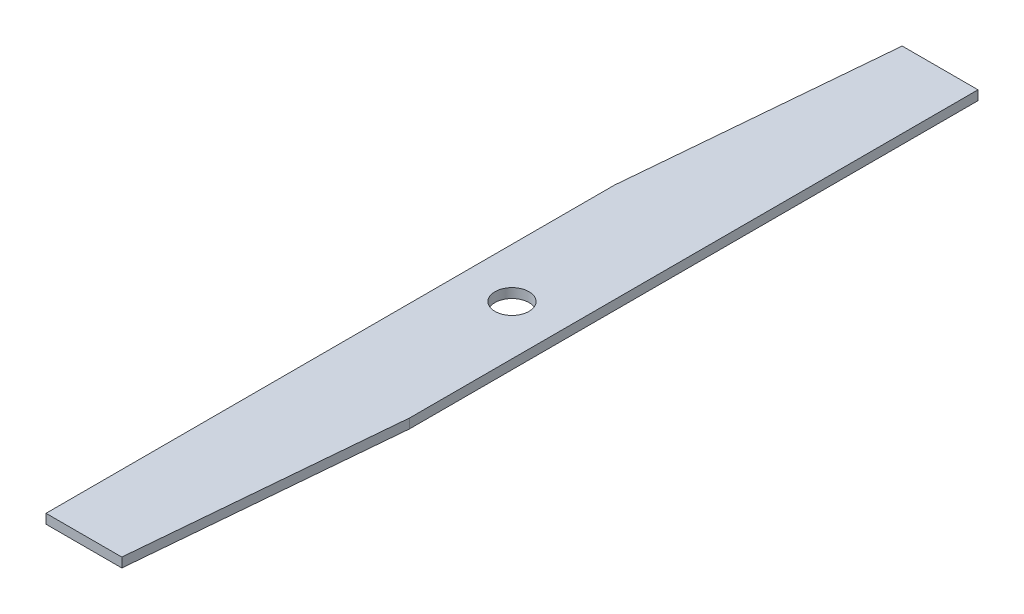
ISO-10303-21;
HEADER;
FILE_DESCRIPTION(('STEP AP214'),'2;1');
FILE_NAME('part.step','',(''),(''),'','','');
FILE_SCHEMA(('AUTOMOTIVE_DESIGN { 1 0 10303 214 1 1 1 1 }'));
ENDSEC;
DATA;
#1=APPLICATION_CONTEXT('core data for automotive mechanical design processes');
#2=APPLICATION_PROTOCOL_DEFINITION('international standard','automotive_design',2000,#1);
#3=PRODUCT_CONTEXT('',#1,'mechanical');
#4=PRODUCT('Part','Part','',(#3));
#5=PRODUCT_RELATED_PRODUCT_CATEGORY('part','',(#4));
#6=PRODUCT_DEFINITION_FORMATION('','',#4);
#7=PRODUCT_DEFINITION_CONTEXT('part definition',#1,'design');
#8=PRODUCT_DEFINITION('design','',#6,#7);
#9=PRODUCT_DEFINITION_SHAPE('','',#8);
#10=(LENGTH_UNIT() NAMED_UNIT(*) SI_UNIT(.MILLI.,.METRE.));
#11=(NAMED_UNIT(*) PLANE_ANGLE_UNIT() SI_UNIT($,.RADIAN.));
#12=(NAMED_UNIT(*) SI_UNIT($,.STERADIAN.) SOLID_ANGLE_UNIT());
#13=UNCERTAINTY_MEASURE_WITH_UNIT(LENGTH_MEASURE(1.E-05),#10,'distance_accuracy_value','');
#14=(GEOMETRIC_REPRESENTATION_CONTEXT(3) GLOBAL_UNCERTAINTY_ASSIGNED_CONTEXT((#13)) GLOBAL_UNIT_ASSIGNED_CONTEXT((#10,
#11,#12)) REPRESENTATION_CONTEXT('',''));
#15=CARTESIAN_POINT('',(0.,0.,0.));
#16=DIRECTION('',(0.,0.,1.));
#17=DIRECTION('',(1.,0.,0.));
#18=AXIS2_PLACEMENT_3D('',#15,#16,#17);
#19=CARTESIAN_POINT('',(-16.7518020827997,3.175,-1.48465657835669));
#20=DIRECTION('',(-0.996095641566478,0.,-0.0882806482320224));
#21=DIRECTION('',(-0.0882806482320225,0.,0.996095641566478));
#22=AXIS2_PLACEMENT_3D('',#19,#20,#21);
#23=PLANE('',#22);
#24=DIRECTION('',(0.0882806482320225,0.,-0.996095641566478));
#25=VECTOR('',#24,1.);
#26=CARTESIAN_POINT('',(-16.7518020827997,0.,-1.48465657835669));
#27=LINE('',#26,#25);
#28=CARTESIAN_POINT('',(0.,0.,-190.5));
#29=VERTEX_POINT('',#28);
#30=CARTESIAN_POINT('',(7.84814962782679,0.,-279.05290253526));
#31=VERTEX_POINT('',#30);
#32=EDGE_CURVE('E117',#29,#31,#27,.T.);
#33=ORIENTED_EDGE('',*,*,#32,.F.);
#34=DIRECTION('',(0.,-1.,0.));
#35=VECTOR('',#34,1.);
#36=CARTESIAN_POINT('',(0.,3.175,-190.5));
#37=LINE('',#36,#35);
#38=CARTESIAN_POINT('',(0.,3.175,-190.5));
#39=VERTEX_POINT('',#38);
#40=EDGE_CURVE('E11',#39,#29,#37,.T.);
#41=ORIENTED_EDGE('',*,*,#40,.F.);
#42=DIRECTION('',(0.0882806482320225,0.,-0.996095641566478));
#43=VECTOR('',#42,1.);
#44=CARTESIAN_POINT('',(-16.7518020827997,3.175,-1.48465657835669));
#45=LINE('',#44,#43);
#46=CARTESIAN_POINT('',(7.84814962782679,3.175,-279.05290253526));
#47=VERTEX_POINT('',#46);
#48=EDGE_CURVE('E228',#39,#47,#45,.T.);
#49=ORIENTED_EDGE('',*,*,#48,.T.);
#50=DIRECTION('',(0.,-1.,0.));
#51=VECTOR('',#50,1.);
#52=CARTESIAN_POINT('',(7.84814962782679,3.175,-279.05290253526));
#53=LINE('',#52,#51);
#54=EDGE_CURVE('E49',#47,#31,#53,.T.);
#55=ORIENTED_EDGE('',*,*,#54,.T.);
#56=EDGE_LOOP('',(#33,#41,#49,#55));
#57=FACE_BOUND('',#56,.T.);
#58=ADVANCED_FACE('F32',(#57),#23,.T.);
#59=CARTESIAN_POINT('',(0.,3.175,0.));
#60=DIRECTION('',(-1.,0.,0.));
#61=DIRECTION('',(0.,0.,1.));
#62=AXIS2_PLACEMENT_3D('',#59,#60,#61);
#63=PLANE('',#62);
#64=DIRECTION('',(0.,0.,-1.));
#65=VECTOR('',#64,1.);
#66=CARTESIAN_POINT('',(0.,0.,0.));
#67=LINE('',#66,#65);
#68=CARTESIAN_POINT('',(0.,0.,0.));
#69=VERTEX_POINT('',#68);
#70=EDGE_CURVE('E119',#69,#29,#67,.T.);
#71=ORIENTED_EDGE('',*,*,#70,.F.);
#72=DIRECTION('',(0.,-1.,0.));
#73=VECTOR('',#72,1.);
#74=CARTESIAN_POINT('',(0.,3.175,0.));
#75=LINE('',#74,#73);
#76=CARTESIAN_POINT('',(0.,3.175,0.));
#77=VERTEX_POINT('',#76);
#78=EDGE_CURVE('E41',#77,#69,#75,.T.);
#79=ORIENTED_EDGE('',*,*,#78,.F.);
#80=DIRECTION('',(0.,0.,-1.));
#81=VECTOR('',#80,1.);
#82=CARTESIAN_POINT('',(0.,3.175,0.));
#83=LINE('',#82,#81);
#84=EDGE_CURVE('E143',#77,#39,#83,.T.);
#85=ORIENTED_EDGE('',*,*,#84,.T.);
#86=ORIENTED_EDGE('',*,*,#40,.T.);
#87=EDGE_LOOP('',(#71,#79,#85,#86));
#88=FACE_BOUND('',#87,.T.);
#89=ADVANCED_FACE('F142',(#88),#63,.T.);
#90=CARTESIAN_POINT('',(0.,3.175,0.));
#91=DIRECTION('',(0.,0.,-1.));
#92=DIRECTION('',(-1.,0.,0.));
#93=AXIS2_PLACEMENT_3D('',#90,#91,#92);
#94=PLANE('',#93);
#95=DIRECTION('',(1.,0.,0.));
#96=VECTOR('',#95,1.);
#97=CARTESIAN_POINT('',(0.,0.,0.));
#98=LINE('',#97,#96);
#99=CARTESIAN_POINT('',(25.4,0.,0.));
#100=VERTEX_POINT('',#99);
#101=EDGE_CURVE('E122',#69,#100,#98,.T.);
#102=ORIENTED_EDGE('',*,*,#101,.T.);
#103=DIRECTION('',(0.,-1.,0.));
#104=VECTOR('',#103,1.);
#105=CARTESIAN_POINT('',(25.4,3.175,0.));
#106=LINE('',#105,#104);
#107=CARTESIAN_POINT('',(25.4,3.175,0.));
#108=VERTEX_POINT('',#107);
#109=EDGE_CURVE('E96',#108,#100,#106,.T.);
#110=ORIENTED_EDGE('',*,*,#109,.F.);
#111=DIRECTION('',(1.,0.,0.));
#112=VECTOR('',#111,1.);
#113=CARTESIAN_POINT('',(0.,3.175,0.));
#114=LINE('',#113,#112);
#115=EDGE_CURVE('E105',#77,#108,#114,.T.);
#116=ORIENTED_EDGE('',*,*,#115,.F.);
#117=ORIENTED_EDGE('',*,*,#78,.T.);
#118=EDGE_LOOP('',(#102,#110,#116,#117));
#119=FACE_BOUND('',#118,.T.);
#120=ADVANCED_FACE('F136',(#119),#94,.F.);
#121=CARTESIAN_POINT('',(25.2020457895524,3.175,2.23357361103996));
#122=DIRECTION('',(0.996095641566478,0.,0.0882806482320227));
#123=DIRECTION('',(0.0882806482320227,0.,-0.996095641566478));
#124=AXIS2_PLACEMENT_3D('',#121,#122,#123);
#125=PLANE('',#124);
#126=DIRECTION('',(-0.0882806482320228,0.,0.996095641566478));
#127=VECTOR('',#126,1.);
#128=CARTESIAN_POINT('',(25.2020457895524,0.,2.23357361103996));
#129=LINE('',#128,#127);
#130=CARTESIAN_POINT('',(33.2481496278268,0.,-88.5529025352599));
#131=VERTEX_POINT('',#130);
#132=EDGE_CURVE('E92',#131,#100,#129,.T.);
#133=ORIENTED_EDGE('',*,*,#132,.F.);
#134=DIRECTION('',(0.,-1.,0.));
#135=VECTOR('',#134,1.);
#136=CARTESIAN_POINT('',(33.2481496278268,3.175,-88.5529025352599));
#137=LINE('',#136,#135);
#138=CARTESIAN_POINT('',(33.2481496278268,3.175,-88.5529025352599));
#139=VERTEX_POINT('',#138);
#140=EDGE_CURVE('E87',#139,#131,#137,.T.);
#141=ORIENTED_EDGE('',*,*,#140,.F.);
#142=DIRECTION('',(-0.0882806482320228,0.,0.996095641566478));
#143=VECTOR('',#142,1.);
#144=CARTESIAN_POINT('',(25.2020457895524,3.175,2.23357361103996));
#145=LINE('',#144,#143);
#146=EDGE_CURVE('E90',#139,#108,#145,.T.);
#147=ORIENTED_EDGE('',*,*,#146,.T.);
#148=ORIENTED_EDGE('',*,*,#109,.T.);
#149=EDGE_LOOP('',(#133,#141,#147,#148));
#150=FACE_BOUND('',#149,.T.);
#151=ADVANCED_FACE('F89',(#150),#125,.T.);
#152=CARTESIAN_POINT('',(33.2481496278268,3.175,0.));
#153=DIRECTION('',(1.,0.,0.));
#154=DIRECTION('',(0.,0.,-1.));
#155=AXIS2_PLACEMENT_3D('',#152,#153,#154);
#156=PLANE('',#155);
#157=DIRECTION('',(0.,0.,1.));
#158=VECTOR('',#157,1.);
#159=CARTESIAN_POINT('',(33.2481496278268,0.,0.));
#160=LINE('',#159,#158);
#161=CARTESIAN_POINT('',(33.2481496278268,0.,-279.05290253526));
#162=VERTEX_POINT('',#161);
#163=EDGE_CURVE('E126',#162,#131,#160,.T.);
#164=ORIENTED_EDGE('',*,*,#163,.F.);
#165=DIRECTION('',(0.,-1.,0.));
#166=VECTOR('',#165,1.);
#167=CARTESIAN_POINT('',(33.2481496278268,3.175,-279.05290253526));
#168=LINE('',#167,#166);
#169=CARTESIAN_POINT('',(33.2481496278268,3.175,-279.05290253526));
#170=VERTEX_POINT('',#169);
#171=EDGE_CURVE('E68',#170,#162,#168,.T.);
#172=ORIENTED_EDGE('',*,*,#171,.F.);
#173=DIRECTION('',(0.,0.,1.));
#174=VECTOR('',#173,1.);
#175=CARTESIAN_POINT('',(33.2481496278268,3.175,0.));
#176=LINE('',#175,#174);
#177=EDGE_CURVE('E102',#170,#139,#176,.T.);
#178=ORIENTED_EDGE('',*,*,#177,.T.);
#179=ORIENTED_EDGE('',*,*,#140,.T.);
#180=EDGE_LOOP('',(#164,#172,#178,#179));
#181=FACE_BOUND('',#180,.T.);
#182=ADVANCED_FACE('F108',(#181),#156,.T.);
#183=CARTESIAN_POINT('',(16.6240748139134,3.175,-139.52645126763));
#184=DIRECTION('',(0.,-1.,0.));
#185=DIRECTION('',(0.,0.,-1.));
#186=AXIS2_PLACEMENT_3D('',#183,#184,#185);
#187=CYLINDRICAL_SURFACE('',#186,5.715);
#188=CARTESIAN_POINT('',(16.6240748139134,3.175,-139.52645126763));
#189=DIRECTION('',(0.,1.,0.));
#190=DIRECTION('',(0.,0.,1.));
#191=AXIS2_PLACEMENT_3D('',#188,#189,#190);
#192=CIRCLE('',#191,5.715);
#193=CARTESIAN_POINT('',(16.6240748139134,3.175,-133.81145126763));
#194=VERTEX_POINT('',#193);
#195=EDGE_CURVE('E131',#194,#194,#192,.T.);
#196=ORIENTED_EDGE('',*,*,#195,.T.);
#197=EDGE_LOOP('',(#196));
#198=FACE_BOUND('',#197,.T.);
#199=CARTESIAN_POINT('',(16.6240748139134,0.,-139.52645126763));
#200=DIRECTION('',(0.,1.,0.));
#201=DIRECTION('',(0.,0.,1.));
#202=AXIS2_PLACEMENT_3D('',#199,#200,#201);
#203=CIRCLE('',#202,5.715);
#204=CARTESIAN_POINT('',(16.6240748139134,0.,-133.81145126763));
#205=VERTEX_POINT('',#204);
#206=EDGE_CURVE('E114',#205,#205,#203,.T.);
#207=ORIENTED_EDGE('',*,*,#206,.F.);
#208=EDGE_LOOP('',(#207));
#209=FACE_BOUND('',#208,.T.);
#210=ADVANCED_FACE('F34',(#198,#209),#187,.F.);
#211=CARTESIAN_POINT('',(-6.09864089533711E-13,3.175,-279.05290253526));
#212=DIRECTION('',(0.,0.,-1.));
#213=DIRECTION('',(-1.,0.,0.));
#214=AXIS2_PLACEMENT_3D('',#211,#212,#213);
#215=PLANE('',#214);
#216=DIRECTION('',(1.,0.,0.));
#217=VECTOR('',#216,1.);
#218=CARTESIAN_POINT('',(-6.09864089533711E-13,0.,-279.05290253526));
#219=LINE('',#218,#217);
#220=EDGE_CURVE('E128',#31,#162,#219,.T.);
#221=ORIENTED_EDGE('',*,*,#220,.F.);
#222=ORIENTED_EDGE('',*,*,#54,.F.);
#223=DIRECTION('',(1.,0.,0.));
#224=VECTOR('',#223,1.);
#225=CARTESIAN_POINT('',(-6.09864089533711E-13,3.175,-279.05290253526));
#226=LINE('',#225,#224);
#227=EDGE_CURVE('E109',#47,#170,#226,.T.);
#228=ORIENTED_EDGE('',*,*,#227,.T.);
#229=ORIENTED_EDGE('',*,*,#171,.T.);
#230=EDGE_LOOP('',(#221,#222,#228,#229));
#231=FACE_BOUND('',#230,.T.);
#232=ADVANCED_FACE('F144',(#231),#215,.T.);
#233=CARTESIAN_POINT('',(0.,3.175,0.));
#234=DIRECTION('',(0.,1.,0.));
#235=DIRECTION('',(0.,0.,1.));
#236=AXIS2_PLACEMENT_3D('',#233,#234,#235);
#237=PLANE('',#236);
#238=ORIENTED_EDGE('',*,*,#195,.F.);
#239=EDGE_LOOP('',(#238));
#240=FACE_BOUND('',#239,.T.);
#241=ORIENTED_EDGE('',*,*,#48,.F.);
#242=ORIENTED_EDGE('',*,*,#84,.F.);
#243=ORIENTED_EDGE('',*,*,#115,.T.);
#244=ORIENTED_EDGE('',*,*,#146,.F.);
#245=ORIENTED_EDGE('',*,*,#177,.F.);
#246=ORIENTED_EDGE('',*,*,#227,.F.);
#247=EDGE_LOOP('',(#241,#242,#243,#244,#245,#246));
#248=FACE_BOUND('',#247,.T.);
#249=ADVANCED_FACE('F100',(#240,#248),#237,.T.);
#250=CARTESIAN_POINT('',(0.,0.,0.));
#251=DIRECTION('',(0.,1.,0.));
#252=DIRECTION('',(0.,0.,1.));
#253=AXIS2_PLACEMENT_3D('',#250,#251,#252);
#254=PLANE('',#253);
#255=ORIENTED_EDGE('',*,*,#206,.T.);
#256=EDGE_LOOP('',(#255));
#257=FACE_BOUND('',#256,.T.);
#258=ORIENTED_EDGE('',*,*,#32,.T.);
#259=ORIENTED_EDGE('',*,*,#220,.T.);
#260=ORIENTED_EDGE('',*,*,#163,.T.);
#261=ORIENTED_EDGE('',*,*,#132,.T.);
#262=ORIENTED_EDGE('',*,*,#101,.F.);
#263=ORIENTED_EDGE('',*,*,#70,.T.);
#264=EDGE_LOOP('',(#258,#259,#260,#261,#262,#263));
#265=FACE_BOUND('',#264,.T.);
#266=ADVANCED_FACE('F141',(#257,#265),#254,.F.);
#267=CLOSED_SHELL('',(#58,#89,#120,#151,#182,#210,#232,#249,#266));
#268=MANIFOLD_SOLID_BREP('B2',#267);
#269=ADVANCED_BREP_SHAPE_REPRESENTATION('',(#18,#268),#14);
#270=SHAPE_DEFINITION_REPRESENTATION(#9,#269);
ENDSEC;
END-ISO-10303-21;
